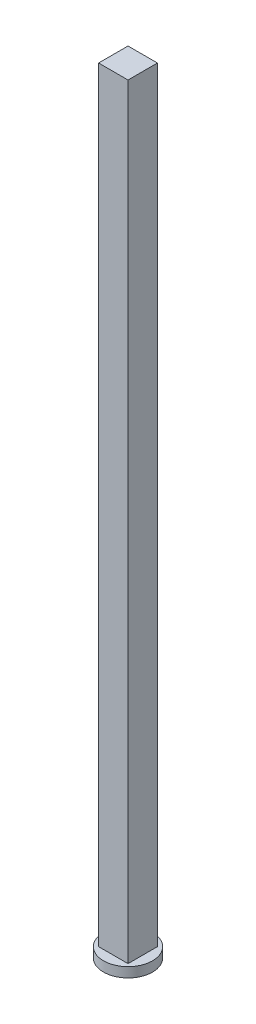
ISO-10303-21;
HEADER;
FILE_DESCRIPTION(('STEP AP214'),'2;1');
FILE_NAME('part.step','',(''),(''),'','','');
FILE_SCHEMA(('AUTOMOTIVE_DESIGN { 1 0 10303 214 1 1 1 1 }'));
ENDSEC;
DATA;
#1=APPLICATION_CONTEXT('core data for automotive mechanical design processes');
#2=APPLICATION_PROTOCOL_DEFINITION('international standard','automotive_design',2000,#1);
#3=PRODUCT_CONTEXT('',#1,'mechanical');
#4=PRODUCT('Part','Part','',(#3));
#5=PRODUCT_RELATED_PRODUCT_CATEGORY('part','',(#4));
#6=PRODUCT_DEFINITION_FORMATION('','',#4);
#7=PRODUCT_DEFINITION_CONTEXT('part definition',#1,'design');
#8=PRODUCT_DEFINITION('design','',#6,#7);
#9=PRODUCT_DEFINITION_SHAPE('','',#8);
#10=(LENGTH_UNIT() NAMED_UNIT(*) SI_UNIT(.MILLI.,.METRE.));
#11=(NAMED_UNIT(*) PLANE_ANGLE_UNIT() SI_UNIT($,.RADIAN.));
#12=(NAMED_UNIT(*) SI_UNIT($,.STERADIAN.) SOLID_ANGLE_UNIT());
#13=UNCERTAINTY_MEASURE_WITH_UNIT(LENGTH_MEASURE(1.E-05),#10,'distance_accuracy_value','');
#14=(GEOMETRIC_REPRESENTATION_CONTEXT(3) GLOBAL_UNCERTAINTY_ASSIGNED_CONTEXT((#13)) GLOBAL_UNIT_ASSIGNED_CONTEXT((#10,
#11,#12)) REPRESENTATION_CONTEXT('',''));
#15=CARTESIAN_POINT('',(0.,0.,0.));
#16=DIRECTION('',(0.,0.,1.));
#17=DIRECTION('',(1.,0.,0.));
#18=AXIS2_PLACEMENT_3D('',#15,#16,#17);
#19=CARTESIAN_POINT('',(1.5,95.,1.5));
#20=DIRECTION('',(-1.,0.,0.));
#21=DIRECTION('',(0.,0.,1.));
#22=AXIS2_PLACEMENT_3D('',#19,#20,#21);
#23=PLANE('',#22);
#24=DIRECTION('',(0.,-1.,0.));
#25=VECTOR('',#24,1.);
#26=CARTESIAN_POINT('',(1.5,95.,-1.5));
#27=LINE('',#26,#25);
#28=CARTESIAN_POINT('',(1.5,78.,-1.5));
#29=VERTEX_POINT('',#28);
#30=CARTESIAN_POINT('',(1.5,0.,-1.5));
#31=VERTEX_POINT('',#30);
#32=EDGE_CURVE('E11',#29,#31,#27,.T.);
#33=ORIENTED_EDGE('',*,*,#32,.F.);
#34=DIRECTION('',(0.,0.,-1.));
#35=VECTOR('',#34,1.);
#36=CARTESIAN_POINT('',(1.5,78.,1.5));
#37=LINE('',#36,#35);
#38=CARTESIAN_POINT('',(1.5,78.,1.5));
#39=VERTEX_POINT('',#38);
#40=EDGE_CURVE('E75',#39,#29,#37,.T.);
#41=ORIENTED_EDGE('',*,*,#40,.F.);
#42=DIRECTION('',(0.,-1.,0.));
#43=VECTOR('',#42,1.);
#44=CARTESIAN_POINT('',(1.5,95.,1.5));
#45=LINE('',#44,#43);
#46=CARTESIAN_POINT('',(1.5,0.,1.5));
#47=VERTEX_POINT('',#46);
#48=EDGE_CURVE('E92',#39,#47,#45,.T.);
#49=ORIENTED_EDGE('',*,*,#48,.T.);
#50=DIRECTION('',(0.,0.,-1.));
#51=VECTOR('',#50,1.);
#52=CARTESIAN_POINT('',(1.5,0.,1.5));
#53=LINE('',#52,#51);
#54=EDGE_CURVE('E91',#47,#31,#53,.T.);
#55=ORIENTED_EDGE('',*,*,#54,.T.);
#56=EDGE_LOOP('',(#33,#41,#49,#55));
#57=FACE_BOUND('',#56,.T.);
#58=ADVANCED_FACE('F38',(#57),#23,.F.);
#59=CARTESIAN_POINT('',(-1.5,95.,-1.5));
#60=DIRECTION('',(0.,0.,1.));
#61=DIRECTION('',(1.,0.,0.));
#62=AXIS2_PLACEMENT_3D('',#59,#60,#61);
#63=PLANE('',#62);
#64=DIRECTION('',(0.,-1.,0.));
#65=VECTOR('',#64,1.);
#66=CARTESIAN_POINT('',(-1.5,95.,-1.5));
#67=LINE('',#66,#65);
#68=CARTESIAN_POINT('',(-1.5,78.,-1.5));
#69=VERTEX_POINT('',#68);
#70=CARTESIAN_POINT('',(-1.5,0.,-1.5));
#71=VERTEX_POINT('',#70);
#72=EDGE_CURVE('E45',#69,#71,#67,.T.);
#73=ORIENTED_EDGE('',*,*,#72,.F.);
#74=DIRECTION('',(-1.,0.,0.));
#75=VECTOR('',#74,1.);
#76=CARTESIAN_POINT('',(-1.5,78.,-1.5));
#77=LINE('',#76,#75);
#78=EDGE_CURVE('E78',#29,#69,#77,.T.);
#79=ORIENTED_EDGE('',*,*,#78,.F.);
#80=ORIENTED_EDGE('',*,*,#32,.T.);
#81=DIRECTION('',(-1.,0.,0.));
#82=VECTOR('',#81,1.);
#83=CARTESIAN_POINT('',(-1.5,0.,-1.5));
#84=LINE('',#83,#82);
#85=EDGE_CURVE('E96',#31,#71,#84,.T.);
#86=ORIENTED_EDGE('',*,*,#85,.T.);
#87=EDGE_LOOP('',(#73,#79,#80,#86));
#88=FACE_BOUND('',#87,.T.);
#89=ADVANCED_FACE('F85',(#88),#63,.F.);
#90=CARTESIAN_POINT('',(-1.5,95.,1.5));
#91=DIRECTION('',(1.,0.,0.));
#92=DIRECTION('',(0.,0.,-1.));
#93=AXIS2_PLACEMENT_3D('',#90,#91,#92);
#94=PLANE('',#93);
#95=DIRECTION('',(0.,-1.,0.));
#96=VECTOR('',#95,1.);
#97=CARTESIAN_POINT('',(-1.5,95.,1.5));
#98=LINE('',#97,#96);
#99=CARTESIAN_POINT('',(-1.5,78.,1.5));
#100=VERTEX_POINT('',#99);
#101=CARTESIAN_POINT('',(-1.5,0.,1.5));
#102=VERTEX_POINT('',#101);
#103=EDGE_CURVE('E110',#100,#102,#98,.T.);
#104=ORIENTED_EDGE('',*,*,#103,.F.);
#105=DIRECTION('',(0.,0.,1.));
#106=VECTOR('',#105,1.);
#107=CARTESIAN_POINT('',(-1.5,78.,1.5));
#108=LINE('',#107,#106);
#109=EDGE_CURVE('E52',#69,#100,#108,.T.);
#110=ORIENTED_EDGE('',*,*,#109,.F.);
#111=ORIENTED_EDGE('',*,*,#72,.T.);
#112=DIRECTION('',(0.,0.,1.));
#113=VECTOR('',#112,1.);
#114=CARTESIAN_POINT('',(-1.5,0.,1.5));
#115=LINE('',#114,#113);
#116=EDGE_CURVE('E99',#71,#102,#115,.T.);
#117=ORIENTED_EDGE('',*,*,#116,.T.);
#118=EDGE_LOOP('',(#104,#110,#111,#117));
#119=FACE_BOUND('',#118,.T.);
#120=ADVANCED_FACE('F116',(#119),#94,.F.);
#121=CARTESIAN_POINT('',(-1.5,95.,1.5));
#122=DIRECTION('',(0.,0.,-1.));
#123=DIRECTION('',(-1.,0.,0.));
#124=AXIS2_PLACEMENT_3D('',#121,#122,#123);
#125=PLANE('',#124);
#126=ORIENTED_EDGE('',*,*,#48,.F.);
#127=DIRECTION('',(1.,0.,0.));
#128=VECTOR('',#127,1.);
#129=CARTESIAN_POINT('',(-1.5,78.,1.5));
#130=LINE('',#129,#128);
#131=EDGE_CURVE('E79',#100,#39,#130,.T.);
#132=ORIENTED_EDGE('',*,*,#131,.F.);
#133=ORIENTED_EDGE('',*,*,#103,.T.);
#134=DIRECTION('',(1.,0.,0.));
#135=VECTOR('',#134,1.);
#136=CARTESIAN_POINT('',(-1.5,0.,1.5));
#137=LINE('',#136,#135);
#138=EDGE_CURVE('E107',#102,#47,#137,.T.);
#139=ORIENTED_EDGE('',*,*,#138,.T.);
#140=EDGE_LOOP('',(#126,#132,#133,#139));
#141=FACE_BOUND('',#140,.T.);
#142=ADVANCED_FACE('F113',(#141),#125,.F.);
#143=CARTESIAN_POINT('',(0.,-1.,0.));
#144=DIRECTION('',(0.,1.,0.));
#145=DIRECTION('',(0.,0.,1.));
#146=AXIS2_PLACEMENT_3D('',#143,#144,#145);
#147=CYLINDRICAL_SURFACE('',#146,2.5);
#148=CARTESIAN_POINT('',(0.,-1.,0.));
#149=DIRECTION('',(0.,-1.,0.));
#150=DIRECTION('',(0.,0.,-1.));
#151=AXIS2_PLACEMENT_3D('',#148,#149,#150);
#152=CIRCLE('',#151,2.5);
#153=CARTESIAN_POINT('',(0.,-1.,-2.5));
#154=VERTEX_POINT('',#153);
#155=EDGE_CURVE('E97',#154,#154,#152,.T.);
#156=ORIENTED_EDGE('',*,*,#155,.F.);
#157=EDGE_LOOP('',(#156));
#158=FACE_BOUND('',#157,.T.);
#159=CARTESIAN_POINT('',(0.,0.,0.));
#160=DIRECTION('',(0.,-1.,0.));
#161=DIRECTION('',(0.,0.,-1.));
#162=AXIS2_PLACEMENT_3D('',#159,#160,#161);
#163=CIRCLE('',#162,2.5);
#164=CARTESIAN_POINT('',(0.,0.,-2.5));
#165=VERTEX_POINT('',#164);
#166=EDGE_CURVE('E102',#165,#165,#163,.T.);
#167=ORIENTED_EDGE('',*,*,#166,.T.);
#168=EDGE_LOOP('',(#167));
#169=FACE_BOUND('',#168,.T.);
#170=ADVANCED_FACE('F123',(#158,#169),#147,.T.);
#171=CARTESIAN_POINT('',(0.,-1.,0.));
#172=DIRECTION('',(0.,-1.,0.));
#173=DIRECTION('',(0.,0.,-1.));
#174=AXIS2_PLACEMENT_3D('',#171,#172,#173);
#175=PLANE('',#174);
#176=ORIENTED_EDGE('',*,*,#155,.T.);
#177=EDGE_LOOP('',(#176));
#178=FACE_BOUND('',#177,.T.);
#179=ADVANCED_FACE('F158',(#178),#175,.T.);
#180=CARTESIAN_POINT('',(0.,0.,0.));
#181=DIRECTION('',(0.,-1.,0.));
#182=DIRECTION('',(0.,0.,-1.));
#183=AXIS2_PLACEMENT_3D('',#180,#181,#182);
#184=PLANE('',#183);
#185=ORIENTED_EDGE('',*,*,#54,.F.);
#186=ORIENTED_EDGE('',*,*,#138,.F.);
#187=ORIENTED_EDGE('',*,*,#116,.F.);
#188=ORIENTED_EDGE('',*,*,#85,.F.);
#189=EDGE_LOOP('',(#185,#186,#187,#188));
#190=FACE_BOUND('',#189,.T.);
#191=ORIENTED_EDGE('',*,*,#166,.F.);
#192=EDGE_LOOP('',(#191));
#193=FACE_BOUND('',#192,.T.);
#194=ADVANCED_FACE('F114',(#190,#193),#184,.F.);
#195=CARTESIAN_POINT('',(0.,78.,0.));
#196=DIRECTION('',(0.,-1.,0.));
#197=DIRECTION('',(0.,0.,-1.));
#198=AXIS2_PLACEMENT_3D('',#195,#196,#197);
#199=PLANE('',#198);
#200=ORIENTED_EDGE('',*,*,#40,.T.);
#201=ORIENTED_EDGE('',*,*,#78,.T.);
#202=ORIENTED_EDGE('',*,*,#109,.T.);
#203=ORIENTED_EDGE('',*,*,#131,.T.);
#204=EDGE_LOOP('',(#200,#201,#202,#203));
#205=FACE_BOUND('',#204,.T.);
#206=ADVANCED_FACE('F77',(#205),#199,.F.);
#207=CLOSED_SHELL('',(#58,#89,#120,#142,#170,#179,#194,#206));
#208=MANIFOLD_SOLID_BREP('B2',#207);
#209=ADVANCED_BREP_SHAPE_REPRESENTATION('',(#18,#208),#14);
#210=SHAPE_DEFINITION_REPRESENTATION(#9,#209);
ENDSEC;
END-ISO-10303-21;
